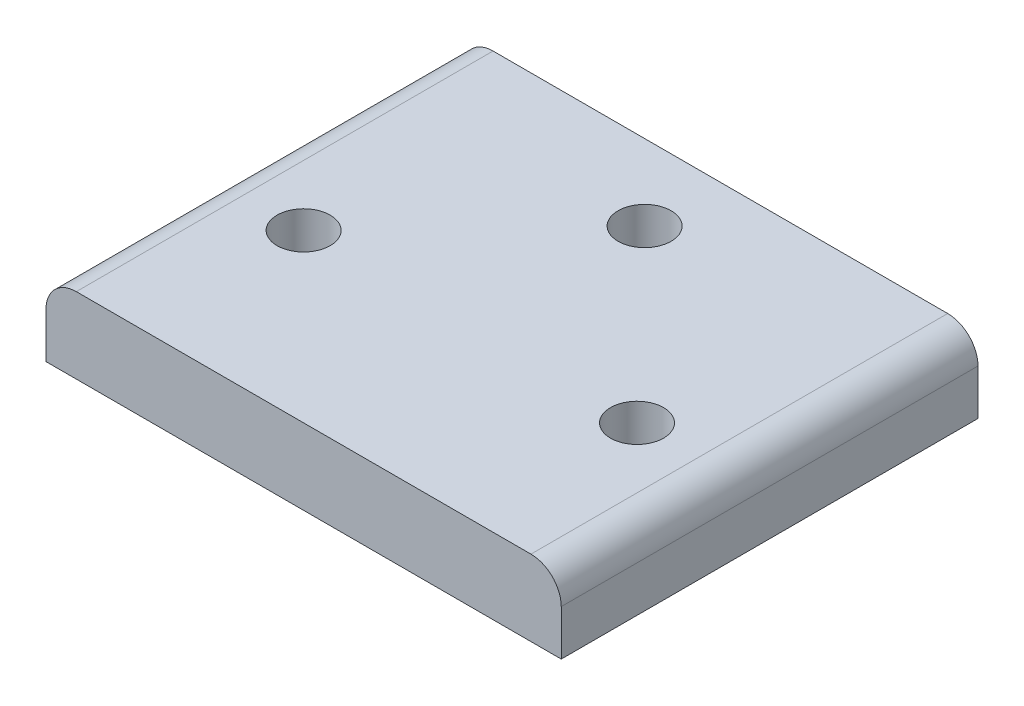
ISO-10303-21;
HEADER;
FILE_DESCRIPTION(('STEP AP214'),'2;1');
FILE_NAME('part.step','',(''),(''),'','','');
FILE_SCHEMA(('AUTOMOTIVE_DESIGN { 1 0 10303 214 1 1 1 1 }'));
ENDSEC;
DATA;
#1=APPLICATION_CONTEXT('core data for automotive mechanical design processes');
#2=APPLICATION_PROTOCOL_DEFINITION('international standard','automotive_design',2000,#1);
#3=PRODUCT_CONTEXT('',#1,'mechanical');
#4=PRODUCT('Part','Part','',(#3));
#5=PRODUCT_RELATED_PRODUCT_CATEGORY('part','',(#4));
#6=PRODUCT_DEFINITION_FORMATION('','',#4);
#7=PRODUCT_DEFINITION_CONTEXT('part definition',#1,'design');
#8=PRODUCT_DEFINITION('design','',#6,#7);
#9=PRODUCT_DEFINITION_SHAPE('','',#8);
#10=(LENGTH_UNIT() NAMED_UNIT(*) SI_UNIT(.MILLI.,.METRE.));
#11=(NAMED_UNIT(*) PLANE_ANGLE_UNIT() SI_UNIT($,.RADIAN.));
#12=(NAMED_UNIT(*) SI_UNIT($,.STERADIAN.) SOLID_ANGLE_UNIT());
#13=UNCERTAINTY_MEASURE_WITH_UNIT(LENGTH_MEASURE(1.E-05),#10,'distance_accuracy_value','');
#14=(GEOMETRIC_REPRESENTATION_CONTEXT(3) GLOBAL_UNCERTAINTY_ASSIGNED_CONTEXT((#13)) GLOBAL_UNIT_ASSIGNED_CONTEXT((#10,
#11,#12)) REPRESENTATION_CONTEXT('',''));
#15=CARTESIAN_POINT('',(0.,0.,0.));
#16=DIRECTION('',(0.,0.,1.));
#17=DIRECTION('',(1.,0.,0.));
#18=AXIS2_PLACEMENT_3D('',#15,#16,#17);
#19=CARTESIAN_POINT('',(0.,5.,0.));
#20=DIRECTION('',(0.,-1.,0.));
#21=DIRECTION('',(0.,0.,-1.));
#22=AXIS2_PLACEMENT_3D('',#19,#20,#21);
#23=PLANE('',#22);
#24=DIRECTION('',(-1.,0.,0.));
#25=VECTOR('',#24,1.);
#26=CARTESIAN_POINT('',(-17.,5.,-13.75));
#27=LINE('',#26,#25);
#28=CARTESIAN_POINT('',(15.,5.,-13.75));
#29=VERTEX_POINT('',#28);
#30=CARTESIAN_POINT('',(-15.,5.,-13.75));
#31=VERTEX_POINT('',#30);
#32=EDGE_CURVE('E121',#29,#31,#27,.T.);
#33=ORIENTED_EDGE('',*,*,#32,.T.);
#34=DIRECTION('',(0.,0.,1.));
#35=VECTOR('',#34,1.);
#36=CARTESIAN_POINT('',(-15.,5.,0.));
#37=LINE('',#36,#35);
#38=CARTESIAN_POINT('',(-15.,5.,13.75));
#39=VERTEX_POINT('',#38);
#40=EDGE_CURVE('E128',#31,#39,#37,.T.);
#41=ORIENTED_EDGE('',*,*,#40,.T.);
#42=DIRECTION('',(1.,0.,0.));
#43=VECTOR('',#42,1.);
#44=CARTESIAN_POINT('',(-17.,5.,13.75));
#45=LINE('',#44,#43);
#46=CARTESIAN_POINT('',(15.,5.,13.75));
#47=VERTEX_POINT('',#46);
#48=EDGE_CURVE('E115',#39,#47,#45,.T.);
#49=ORIENTED_EDGE('',*,*,#48,.T.);
#50=DIRECTION('',(0.,0.,-1.));
#51=VECTOR('',#50,1.);
#52=CARTESIAN_POINT('',(15.,5.,0.));
#53=LINE('',#52,#51);
#54=EDGE_CURVE('E93',#47,#29,#53,.T.);
#55=ORIENTED_EDGE('',*,*,#54,.T.);
#56=EDGE_LOOP('',(#33,#41,#49,#55));
#57=FACE_BOUND('',#56,.T.);
#58=CARTESIAN_POINT('',(0.,5.,-8.75));
#59=DIRECTION('',(0.,1.,0.));
#60=DIRECTION('',(0.,0.,1.));
#61=AXIS2_PLACEMENT_3D('',#58,#59,#60);
#62=CIRCLE('',#61,1.75);
#63=CARTESIAN_POINT('',(0.,5.,-7.));
#64=VERTEX_POINT('',#63);
#65=EDGE_CURVE('E109',#64,#64,#62,.T.);
#66=ORIENTED_EDGE('',*,*,#65,.F.);
#67=EDGE_LOOP('',(#66));
#68=FACE_BOUND('',#67,.T.);
#69=CARTESIAN_POINT('',(-11.,5.,2.75));
#70=DIRECTION('',(0.,1.,0.));
#71=DIRECTION('',(0.,0.,1.));
#72=AXIS2_PLACEMENT_3D('',#69,#70,#71);
#73=CIRCLE('',#72,1.75);
#74=CARTESIAN_POINT('',(-11.,5.,4.5));
#75=VERTEX_POINT('',#74);
#76=EDGE_CURVE('E312',#75,#75,#73,.T.);
#77=ORIENTED_EDGE('',*,*,#76,.F.);
#78=EDGE_LOOP('',(#77));
#79=FACE_BOUND('',#78,.T.);
#80=CARTESIAN_POINT('',(11.,5.,2.75));
#81=DIRECTION('',(0.,1.,0.));
#82=DIRECTION('',(0.,0.,1.));
#83=AXIS2_PLACEMENT_3D('',#80,#81,#82);
#84=CIRCLE('',#83,1.75);
#85=CARTESIAN_POINT('',(11.,5.,4.5));
#86=VERTEX_POINT('',#85);
#87=EDGE_CURVE('E306',#86,#86,#84,.T.);
#88=ORIENTED_EDGE('',*,*,#87,.F.);
#89=EDGE_LOOP('',(#88));
#90=FACE_BOUND('',#89,.T.);
#91=ADVANCED_FACE('F34',(#57,#68,#79,#90),#23,.F.);
#92=CARTESIAN_POINT('',(0.,0.,0.));
#93=DIRECTION('',(0.,-1.,0.));
#94=DIRECTION('',(0.,0.,-1.));
#95=AXIS2_PLACEMENT_3D('',#92,#93,#94);
#96=PLANE('',#95);
#97=CARTESIAN_POINT('',(5.3,0.,7.5));
#98=DIRECTION('',(0.,-1.,0.));
#99=DIRECTION('',(0.,0.,-1.));
#100=AXIS2_PLACEMENT_3D('',#97,#98,#99);
#101=CIRCLE('',#100,5.25);
#102=CARTESIAN_POINT('',(5.3,0.,2.25));
#103=VERTEX_POINT('',#102);
#104=EDGE_CURVE('E291',#103,#103,#101,.T.);
#105=ORIENTED_EDGE('',*,*,#104,.F.);
#106=EDGE_LOOP('',(#105));
#107=FACE_BOUND('',#106,.T.);
#108=CARTESIAN_POINT('',(0.,0.,-1.7));
#109=DIRECTION('',(0.,-1.,0.));
#110=DIRECTION('',(0.,0.,-1.));
#111=AXIS2_PLACEMENT_3D('',#108,#109,#110);
#112=CIRCLE('',#111,5.25);
#113=CARTESIAN_POINT('',(0.,0.,-6.95));
#114=VERTEX_POINT('',#113);
#115=EDGE_CURVE('E300',#114,#114,#112,.T.);
#116=ORIENTED_EDGE('',*,*,#115,.F.);
#117=EDGE_LOOP('',(#116));
#118=FACE_BOUND('',#117,.T.);
#119=CARTESIAN_POINT('',(-5.3,0.,7.5));
#120=DIRECTION('',(0.,-1.,0.));
#121=DIRECTION('',(0.,0.,-1.));
#122=AXIS2_PLACEMENT_3D('',#119,#120,#121);
#123=CIRCLE('',#122,5.25);
#124=CARTESIAN_POINT('',(-5.3,0.,2.25));
#125=VERTEX_POINT('',#124);
#126=EDGE_CURVE('E290',#125,#125,#123,.T.);
#127=ORIENTED_EDGE('',*,*,#126,.F.);
#128=EDGE_LOOP('',(#127));
#129=FACE_BOUND('',#128,.T.);
#130=CARTESIAN_POINT('',(-11.,0.,2.75));
#131=DIRECTION('',(0.,1.,0.));
#132=DIRECTION('',(0.,0.,1.));
#133=AXIS2_PLACEMENT_3D('',#130,#131,#132);
#134=CIRCLE('',#133,1.75);
#135=CARTESIAN_POINT('',(-11.,0.,4.5));
#136=VERTEX_POINT('',#135);
#137=EDGE_CURVE('E309',#136,#136,#134,.T.);
#138=ORIENTED_EDGE('',*,*,#137,.T.);
#139=EDGE_LOOP('',(#138));
#140=FACE_BOUND('',#139,.T.);
#141=DIRECTION('',(0.,0.,-1.));
#142=VECTOR('',#141,1.);
#143=CARTESIAN_POINT('',(17.,0.,13.75));
#144=LINE('',#143,#142);
#145=CARTESIAN_POINT('',(17.,0.,13.75));
#146=VERTEX_POINT('',#145);
#147=CARTESIAN_POINT('',(17.,0.,-13.75));
#148=VERTEX_POINT('',#147);
#149=EDGE_CURVE('E101',#146,#148,#144,.T.);
#150=ORIENTED_EDGE('',*,*,#149,.F.);
#151=DIRECTION('',(1.,0.,0.));
#152=VECTOR('',#151,1.);
#153=CARTESIAN_POINT('',(-17.,0.,13.75));
#154=LINE('',#153,#152);
#155=CARTESIAN_POINT('',(-17.,0.,13.75));
#156=VERTEX_POINT('',#155);
#157=EDGE_CURVE('E119',#156,#146,#154,.T.);
#158=ORIENTED_EDGE('',*,*,#157,.F.);
#159=DIRECTION('',(0.,0.,1.));
#160=VECTOR('',#159,1.);
#161=CARTESIAN_POINT('',(-17.,0.,13.75));
#162=LINE('',#161,#160);
#163=CARTESIAN_POINT('',(-17.,0.,-13.75));
#164=VERTEX_POINT('',#163);
#165=EDGE_CURVE('E103',#164,#156,#162,.T.);
#166=ORIENTED_EDGE('',*,*,#165,.F.);
#167=DIRECTION('',(-1.,0.,0.));
#168=VECTOR('',#167,1.);
#169=CARTESIAN_POINT('',(-17.,0.,-13.75));
#170=LINE('',#169,#168);
#171=EDGE_CURVE('E88',#148,#164,#170,.T.);
#172=ORIENTED_EDGE('',*,*,#171,.F.);
#173=EDGE_LOOP('',(#150,#158,#166,#172));
#174=FACE_BOUND('',#173,.T.);
#175=CARTESIAN_POINT('',(0.,0.,-8.75));
#176=DIRECTION('',(0.,1.,0.));
#177=DIRECTION('',(0.,0.,1.));
#178=AXIS2_PLACEMENT_3D('',#175,#176,#177);
#179=CIRCLE('',#178,1.75);
#180=CARTESIAN_POINT('',(0.,0.,-7.));
#181=VERTEX_POINT('',#180);
#182=EDGE_CURVE('E112',#181,#181,#179,.T.);
#183=ORIENTED_EDGE('',*,*,#182,.T.);
#184=EDGE_LOOP('',(#183));
#185=FACE_BOUND('',#184,.T.);
#186=CARTESIAN_POINT('',(11.,0.,2.75));
#187=DIRECTION('',(0.,1.,0.));
#188=DIRECTION('',(0.,0.,1.));
#189=AXIS2_PLACEMENT_3D('',#186,#187,#188);
#190=CIRCLE('',#189,1.75);
#191=CARTESIAN_POINT('',(11.,0.,4.5));
#192=VERTEX_POINT('',#191);
#193=EDGE_CURVE('E304',#192,#192,#190,.T.);
#194=ORIENTED_EDGE('',*,*,#193,.T.);
#195=EDGE_LOOP('',(#194));
#196=FACE_BOUND('',#195,.T.);
#197=ADVANCED_FACE('F98',(#107,#118,#129,#140,#174,#185,#196),#96,.T.);
#198=CARTESIAN_POINT('',(17.,5.,13.75));
#199=DIRECTION('',(-1.,0.,0.));
#200=DIRECTION('',(0.,0.,1.));
#201=AXIS2_PLACEMENT_3D('',#198,#199,#200);
#202=PLANE('',#201);
#203=DIRECTION('',(0.,-1.,0.));
#204=VECTOR('',#203,1.);
#205=CARTESIAN_POINT('',(17.,5.,-13.75));
#206=LINE('',#205,#204);
#207=CARTESIAN_POINT('',(17.,3.,-13.75));
#208=VERTEX_POINT('',#207);
#209=EDGE_CURVE('E85',#208,#148,#206,.T.);
#210=ORIENTED_EDGE('',*,*,#209,.F.);
#211=DIRECTION('',(0.,0.,-1.));
#212=VECTOR('',#211,1.);
#213=CARTESIAN_POINT('',(17.,3.,13.75));
#214=LINE('',#213,#212);
#215=CARTESIAN_POINT('',(17.,3.,13.75));
#216=VERTEX_POINT('',#215);
#217=EDGE_CURVE('E11',#208,#216,#214,.F.);
#218=ORIENTED_EDGE('',*,*,#217,.T.);
#219=DIRECTION('',(0.,-1.,0.));
#220=VECTOR('',#219,1.);
#221=CARTESIAN_POINT('',(17.,5.,13.75));
#222=LINE('',#221,#220);
#223=EDGE_CURVE('E107',#216,#146,#222,.T.);
#224=ORIENTED_EDGE('',*,*,#223,.T.);
#225=ORIENTED_EDGE('',*,*,#149,.T.);
#226=EDGE_LOOP('',(#210,#218,#224,#225));
#227=FACE_BOUND('',#226,.T.);
#228=ADVANCED_FACE('F105',(#227),#202,.F.);
#229=CARTESIAN_POINT('',(-17.,5.,-13.75));
#230=DIRECTION('',(0.,0.,1.));
#231=DIRECTION('',(1.,0.,0.));
#232=AXIS2_PLACEMENT_3D('',#229,#230,#231);
#233=PLANE('',#232);
#234=DIRECTION('',(0.,-1.,0.));
#235=VECTOR('',#234,1.);
#236=CARTESIAN_POINT('',(-17.,5.,-13.75));
#237=LINE('',#236,#235);
#238=CARTESIAN_POINT('',(-17.,3.,-13.75));
#239=VERTEX_POINT('',#238);
#240=EDGE_CURVE('E94',#239,#164,#237,.T.);
#241=ORIENTED_EDGE('',*,*,#240,.F.);
#242=CARTESIAN_POINT('',(-15.,3.,-13.75));
#243=DIRECTION('',(0.,0.,1.));
#244=DIRECTION('',(1.,0.,0.));
#245=AXIS2_PLACEMENT_3D('',#242,#243,#244);
#246=CIRCLE('',#245,2.);
#247=EDGE_CURVE('E42',#239,#31,#246,.F.);
#248=ORIENTED_EDGE('',*,*,#247,.T.);
#249=ORIENTED_EDGE('',*,*,#32,.F.);
#250=CARTESIAN_POINT('',(15.,3.,-13.75));
#251=DIRECTION('',(0.,0.,1.));
#252=DIRECTION('',(1.,0.,0.));
#253=AXIS2_PLACEMENT_3D('',#250,#251,#252);
#254=CIRCLE('',#253,2.);
#255=EDGE_CURVE('E49',#29,#208,#254,.F.);
#256=ORIENTED_EDGE('',*,*,#255,.T.);
#257=ORIENTED_EDGE('',*,*,#209,.T.);
#258=ORIENTED_EDGE('',*,*,#171,.T.);
#259=EDGE_LOOP('',(#241,#248,#249,#256,#257,#258));
#260=FACE_BOUND('',#259,.T.);
#261=ADVANCED_FACE('F87',(#260),#233,.F.);
#262=CARTESIAN_POINT('',(-17.,5.,13.75));
#263=DIRECTION('',(1.,0.,0.));
#264=DIRECTION('',(0.,0.,-1.));
#265=AXIS2_PLACEMENT_3D('',#262,#263,#264);
#266=PLANE('',#265);
#267=DIRECTION('',(0.,-1.,0.));
#268=VECTOR('',#267,1.);
#269=CARTESIAN_POINT('',(-17.,5.,13.75));
#270=LINE('',#269,#268);
#271=CARTESIAN_POINT('',(-17.,3.,13.75));
#272=VERTEX_POINT('',#271);
#273=EDGE_CURVE('E123',#272,#156,#270,.T.);
#274=ORIENTED_EDGE('',*,*,#273,.F.);
#275=DIRECTION('',(0.,0.,1.));
#276=VECTOR('',#275,1.);
#277=CARTESIAN_POINT('',(-17.,3.,13.75));
#278=LINE('',#277,#276);
#279=EDGE_CURVE('E57',#272,#239,#278,.F.);
#280=ORIENTED_EDGE('',*,*,#279,.T.);
#281=ORIENTED_EDGE('',*,*,#240,.T.);
#282=ORIENTED_EDGE('',*,*,#165,.T.);
#283=EDGE_LOOP('',(#274,#280,#281,#282));
#284=FACE_BOUND('',#283,.T.);
#285=ADVANCED_FACE('F148',(#284),#266,.F.);
#286=CARTESIAN_POINT('',(-17.,5.,13.75));
#287=DIRECTION('',(0.,0.,-1.));
#288=DIRECTION('',(-1.,0.,0.));
#289=AXIS2_PLACEMENT_3D('',#286,#287,#288);
#290=PLANE('',#289);
#291=ORIENTED_EDGE('',*,*,#48,.F.);
#292=CARTESIAN_POINT('',(-15.,3.,13.75));
#293=DIRECTION('',(0.,0.,-1.));
#294=DIRECTION('',(-1.,0.,0.));
#295=AXIS2_PLACEMENT_3D('',#292,#293,#294);
#296=CIRCLE('',#295,2.);
#297=EDGE_CURVE('E133',#39,#272,#296,.F.);
#298=ORIENTED_EDGE('',*,*,#297,.T.);
#299=ORIENTED_EDGE('',*,*,#273,.T.);
#300=ORIENTED_EDGE('',*,*,#157,.T.);
#301=ORIENTED_EDGE('',*,*,#223,.F.);
#302=CARTESIAN_POINT('',(15.,3.,13.75));
#303=DIRECTION('',(0.,0.,-1.));
#304=DIRECTION('',(-1.,0.,0.));
#305=AXIS2_PLACEMENT_3D('',#302,#303,#304);
#306=CIRCLE('',#305,2.);
#307=EDGE_CURVE('E131',#216,#47,#306,.F.);
#308=ORIENTED_EDGE('',*,*,#307,.T.);
#309=EDGE_LOOP('',(#291,#298,#299,#300,#301,#308));
#310=FACE_BOUND('',#309,.T.);
#311=ADVANCED_FACE('F147',(#310),#290,.F.);
#312=CARTESIAN_POINT('',(0.,5.,-8.75));
#313=DIRECTION('',(0.,-1.,0.));
#314=DIRECTION('',(0.,0.,-1.));
#315=AXIS2_PLACEMENT_3D('',#312,#313,#314);
#316=CYLINDRICAL_SURFACE('',#315,1.75);
#317=ORIENTED_EDGE('',*,*,#65,.T.);
#318=EDGE_LOOP('',(#317));
#319=FACE_BOUND('',#318,.T.);
#320=ORIENTED_EDGE('',*,*,#182,.F.);
#321=EDGE_LOOP('',(#320));
#322=FACE_BOUND('',#321,.T.);
#323=ADVANCED_FACE('F169',(#319,#322),#316,.F.);
#324=CARTESIAN_POINT('',(-11.,5.,2.75));
#325=DIRECTION('',(0.,-1.,0.));
#326=DIRECTION('',(0.,0.,-1.));
#327=AXIS2_PLACEMENT_3D('',#324,#325,#326);
#328=CYLINDRICAL_SURFACE('',#327,1.75);
#329=ORIENTED_EDGE('',*,*,#76,.T.);
#330=EDGE_LOOP('',(#329));
#331=FACE_BOUND('',#330,.T.);
#332=ORIENTED_EDGE('',*,*,#137,.F.);
#333=EDGE_LOOP('',(#332));
#334=FACE_BOUND('',#333,.T.);
#335=ADVANCED_FACE('F202',(#331,#334),#328,.F.);
#336=CARTESIAN_POINT('',(11.,5.,2.75));
#337=DIRECTION('',(0.,-1.,0.));
#338=DIRECTION('',(0.,0.,-1.));
#339=AXIS2_PLACEMENT_3D('',#336,#337,#338);
#340=CYLINDRICAL_SURFACE('',#339,1.75);
#341=ORIENTED_EDGE('',*,*,#87,.T.);
#342=EDGE_LOOP('',(#341));
#343=FACE_BOUND('',#342,.T.);
#344=ORIENTED_EDGE('',*,*,#193,.F.);
#345=EDGE_LOOP('',(#344));
#346=FACE_BOUND('',#345,.T.);
#347=ADVANCED_FACE('F160',(#343,#346),#340,.F.);
#348=CARTESIAN_POINT('',(-15.,3.,0.));
#349=DIRECTION('',(0.,0.,1.));
#350=DIRECTION('',(1.,0.,0.));
#351=AXIS2_PLACEMENT_3D('',#348,#349,#350);
#352=CYLINDRICAL_SURFACE('',#351,2.);
#353=ORIENTED_EDGE('',*,*,#247,.F.);
#354=ORIENTED_EDGE('',*,*,#279,.F.);
#355=ORIENTED_EDGE('',*,*,#297,.F.);
#356=ORIENTED_EDGE('',*,*,#40,.F.);
#357=EDGE_LOOP('',(#353,#354,#355,#356));
#358=FACE_BOUND('',#357,.T.);
#359=ADVANCED_FACE('F145',(#358),#352,.T.);
#360=CARTESIAN_POINT('',(15.,3.,0.));
#361=DIRECTION('',(0.,0.,-1.));
#362=DIRECTION('',(-1.,0.,0.));
#363=AXIS2_PLACEMENT_3D('',#360,#361,#362);
#364=CYLINDRICAL_SURFACE('',#363,2.);
#365=ORIENTED_EDGE('',*,*,#307,.F.);
#366=ORIENTED_EDGE('',*,*,#217,.F.);
#367=ORIENTED_EDGE('',*,*,#255,.F.);
#368=ORIENTED_EDGE('',*,*,#54,.F.);
#369=EDGE_LOOP('',(#365,#366,#367,#368));
#370=FACE_BOUND('',#369,.T.);
#371=ADVANCED_FACE('F36',(#370),#364,.T.);
#372=CARTESIAN_POINT('',(-5.3,0.4,7.5));
#373=DIRECTION('',(0.,-1.,0.));
#374=DIRECTION('',(0.,0.,-1.));
#375=AXIS2_PLACEMENT_3D('',#372,#373,#374);
#376=CYLINDRICAL_SURFACE('',#375,5.25);
#377=CARTESIAN_POINT('',(-5.3,0.4,7.5));
#378=DIRECTION('',(0.,-1.,0.));
#379=DIRECTION('',(0.,0.,-1.));
#380=AXIS2_PLACEMENT_3D('',#377,#378,#379);
#381=CIRCLE('',#380,5.25);
#382=CARTESIAN_POINT('',(-5.3,0.4,2.25));
#383=VERTEX_POINT('',#382);
#384=EDGE_CURVE('E294',#383,#383,#381,.T.);
#385=ORIENTED_EDGE('',*,*,#384,.F.);
#386=EDGE_LOOP('',(#385));
#387=FACE_BOUND('',#386,.T.);
#388=ORIENTED_EDGE('',*,*,#126,.T.);
#389=EDGE_LOOP('',(#388));
#390=FACE_BOUND('',#389,.T.);
#391=ADVANCED_FACE('F152',(#387,#390),#376,.F.);
#392=CARTESIAN_POINT('',(-5.3,0.4,7.5));
#393=DIRECTION('',(0.,-1.,0.));
#394=DIRECTION('',(0.,0.,-1.));
#395=AXIS2_PLACEMENT_3D('',#392,#393,#394);
#396=PLANE('',#395);
#397=ORIENTED_EDGE('',*,*,#384,.T.);
#398=EDGE_LOOP('',(#397));
#399=FACE_BOUND('',#398,.T.);
#400=ADVANCED_FACE('F157',(#399),#396,.T.);
#401=CARTESIAN_POINT('',(0.,0.4,-1.7));
#402=DIRECTION('',(0.,-1.,0.));
#403=DIRECTION('',(0.,0.,-1.));
#404=AXIS2_PLACEMENT_3D('',#401,#402,#403);
#405=CYLINDRICAL_SURFACE('',#404,5.25);
#406=CARTESIAN_POINT('',(0.,0.4,-1.7));
#407=DIRECTION('',(0.,-1.,0.));
#408=DIRECTION('',(0.,0.,-1.));
#409=AXIS2_PLACEMENT_3D('',#406,#407,#408);
#410=CIRCLE('',#409,5.25);
#411=CARTESIAN_POINT('',(0.,0.4,-6.95));
#412=VERTEX_POINT('',#411);
#413=EDGE_CURVE('E297',#412,#412,#410,.T.);
#414=ORIENTED_EDGE('',*,*,#413,.F.);
#415=EDGE_LOOP('',(#414));
#416=FACE_BOUND('',#415,.T.);
#417=ORIENTED_EDGE('',*,*,#115,.T.);
#418=EDGE_LOOP('',(#417));
#419=FACE_BOUND('',#418,.T.);
#420=ADVANCED_FACE('F243',(#416,#419),#405,.F.);
#421=CARTESIAN_POINT('',(0.,0.4,-1.7));
#422=DIRECTION('',(0.,-1.,0.));
#423=DIRECTION('',(0.,0.,-1.));
#424=AXIS2_PLACEMENT_3D('',#421,#422,#423);
#425=PLANE('',#424);
#426=ORIENTED_EDGE('',*,*,#413,.T.);
#427=EDGE_LOOP('',(#426));
#428=FACE_BOUND('',#427,.T.);
#429=ADVANCED_FACE('F253',(#428),#425,.T.);
#430=CARTESIAN_POINT('',(5.3,0.4,7.5));
#431=DIRECTION('',(0.,-1.,0.));
#432=DIRECTION('',(0.,0.,-1.));
#433=AXIS2_PLACEMENT_3D('',#430,#431,#432);
#434=CYLINDRICAL_SURFACE('',#433,5.25);
#435=CARTESIAN_POINT('',(5.3,0.4,7.5));
#436=DIRECTION('',(0.,-1.,0.));
#437=DIRECTION('',(0.,0.,-1.));
#438=AXIS2_PLACEMENT_3D('',#435,#436,#437);
#439=CIRCLE('',#438,5.25);
#440=CARTESIAN_POINT('',(5.3,0.4,2.25));
#441=VERTEX_POINT('',#440);
#442=EDGE_CURVE('E289',#441,#441,#439,.T.);
#443=ORIENTED_EDGE('',*,*,#442,.F.);
#444=EDGE_LOOP('',(#443));
#445=FACE_BOUND('',#444,.T.);
#446=ORIENTED_EDGE('',*,*,#104,.T.);
#447=EDGE_LOOP('',(#446));
#448=FACE_BOUND('',#447,.T.);
#449=ADVANCED_FACE('F263',(#445,#448),#434,.F.);
#450=CARTESIAN_POINT('',(5.3,0.4,7.5));
#451=DIRECTION('',(0.,-1.,0.));
#452=DIRECTION('',(0.,0.,-1.));
#453=AXIS2_PLACEMENT_3D('',#450,#451,#452);
#454=PLANE('',#453);
#455=ORIENTED_EDGE('',*,*,#442,.T.);
#456=EDGE_LOOP('',(#455));
#457=FACE_BOUND('',#456,.T.);
#458=ADVANCED_FACE('F273',(#457),#454,.T.);
#459=CLOSED_SHELL('',(#91,#197,#228,#261,#285,#311,#323,#335,#347,#359,#371,#391,#400,#420,#429,
#449,#458));
#460=MANIFOLD_SOLID_BREP('B2',#459);
#461=ADVANCED_BREP_SHAPE_REPRESENTATION('',(#18,#460),#14);
#462=SHAPE_DEFINITION_REPRESENTATION(#9,#461);
ENDSEC;
END-ISO-10303-21;
